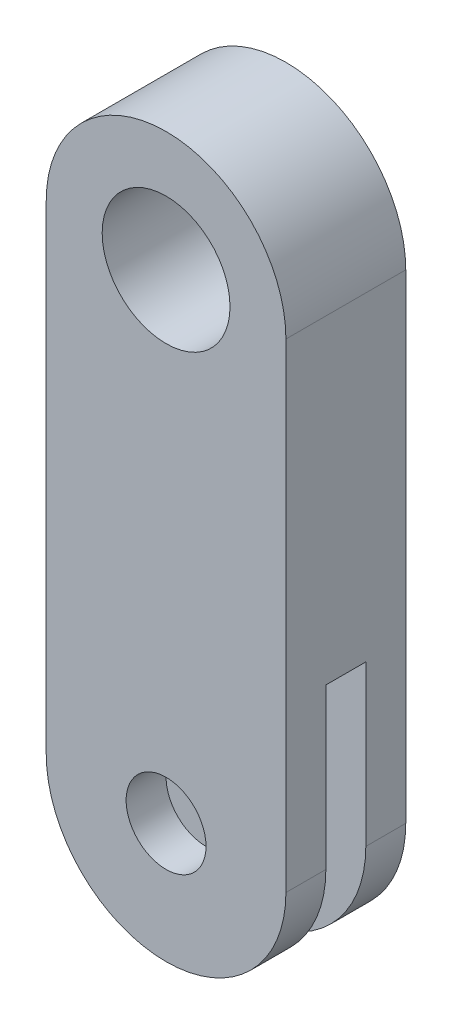
ISO-10303-21;
HEADER;
FILE_DESCRIPTION(('STEP AP214'),'2;1');
FILE_NAME('part.step','',(''),(''),'','','');
FILE_SCHEMA(('AUTOMOTIVE_DESIGN { 1 0 10303 214 1 1 1 1 }'));
ENDSEC;
DATA;
#1=APPLICATION_CONTEXT('core data for automotive mechanical design processes');
#2=APPLICATION_PROTOCOL_DEFINITION('international standard','automotive_design',2000,#1);
#3=PRODUCT_CONTEXT('',#1,'mechanical');
#4=PRODUCT('Part','Part','',(#3));
#5=PRODUCT_RELATED_PRODUCT_CATEGORY('part','',(#4));
#6=PRODUCT_DEFINITION_FORMATION('','',#4);
#7=PRODUCT_DEFINITION_CONTEXT('part definition',#1,'design');
#8=PRODUCT_DEFINITION('design','',#6,#7);
#9=PRODUCT_DEFINITION_SHAPE('','',#8);
#10=(LENGTH_UNIT() NAMED_UNIT(*) SI_UNIT(.MILLI.,.METRE.));
#11=(NAMED_UNIT(*) PLANE_ANGLE_UNIT() SI_UNIT($,.RADIAN.));
#12=(NAMED_UNIT(*) SI_UNIT($,.STERADIAN.) SOLID_ANGLE_UNIT());
#13=UNCERTAINTY_MEASURE_WITH_UNIT(LENGTH_MEASURE(1.E-05),#10,'distance_accuracy_value','');
#14=(GEOMETRIC_REPRESENTATION_CONTEXT(3) GLOBAL_UNCERTAINTY_ASSIGNED_CONTEXT((#13)) GLOBAL_UNIT_ASSIGNED_CONTEXT((#10,
#11,#12)) REPRESENTATION_CONTEXT('',''));
#15=CARTESIAN_POINT('',(0.,0.,0.));
#16=DIRECTION('',(0.,0.,1.));
#17=DIRECTION('',(1.,0.,0.));
#18=AXIS2_PLACEMENT_3D('',#15,#16,#17);
#19=CARTESIAN_POINT('',(-14.3340871670976,80.7958296065914,0.));
#20=DIRECTION('',(0.,0.,1.));
#21=DIRECTION('',(1.,0.,0.));
#22=AXIS2_PLACEMENT_3D('',#19,#20,#21);
#23=PLANE('',#22);
#24=CARTESIAN_POINT('',(-14.3340871670976,20.7958296065914,0.));
#25=DIRECTION('',(0.,0.,1.));
#26=DIRECTION('',(1.,0.,0.));
#27=AXIS2_PLACEMENT_3D('',#24,#25,#26);
#28=CIRCLE('',#27,5.);
#29=CARTESIAN_POINT('',(-9.33408716709757,20.7958296065914,0.));
#30=VERTEX_POINT('',#29);
#31=EDGE_CURVE('E162',#30,#30,#28,.T.);
#32=ORIENTED_EDGE('',*,*,#31,.T.);
#33=EDGE_LOOP('',(#32));
#34=FACE_BOUND('',#33,.T.);
#35=DIRECTION('',(-1.,0.,0.));
#36=VECTOR('',#35,1.);
#37=CARTESIAN_POINT('',(-29.3340871670976,40.7958296065915,0.));
#38=LINE('',#37,#36);
#39=CARTESIAN_POINT('',(0.665912832902425,40.7958296065914,0.));
#40=VERTEX_POINT('',#39);
#41=CARTESIAN_POINT('',(-29.3340871670976,40.7958296065915,0.));
#42=VERTEX_POINT('',#41);
#43=EDGE_CURVE('E48',#40,#42,#38,.T.);
#44=ORIENTED_EDGE('',*,*,#43,.F.);
#45=DIRECTION('',(0.,1.,0.));
#46=VECTOR('',#45,1.);
#47=CARTESIAN_POINT('',(0.665912832902422,20.7958296065914,0.));
#48=LINE('',#47,#46);
#49=CARTESIAN_POINT('',(0.665912832902425,20.7958296065914,0.));
#50=VERTEX_POINT('',#49);
#51=EDGE_CURVE('E170',#50,#40,#48,.T.);
#52=ORIENTED_EDGE('',*,*,#51,.F.);
#53=CARTESIAN_POINT('',(-14.3340871670976,20.7958296065914,0.));
#54=DIRECTION('',(0.,0.,1.));
#55=DIRECTION('',(1.,0.,0.));
#56=AXIS2_PLACEMENT_3D('',#53,#54,#55);
#57=CIRCLE('',#56,15.);
#58=CARTESIAN_POINT('',(-29.3340871670976,20.7958296065914,0.));
#59=VERTEX_POINT('',#58);
#60=EDGE_CURVE('E73',#59,#50,#57,.T.);
#61=ORIENTED_EDGE('',*,*,#60,.F.);
#62=DIRECTION('',(0.,-1.,0.));
#63=VECTOR('',#62,1.);
#64=CARTESIAN_POINT('',(-29.3340871670976,80.7958296065914,0.));
#65=LINE('',#64,#63);
#66=EDGE_CURVE('E166',#42,#59,#65,.T.);
#67=ORIENTED_EDGE('',*,*,#66,.F.);
#68=EDGE_LOOP('',(#44,#52,#61,#67));
#69=FACE_BOUND('',#68,.T.);
#70=ADVANCED_FACE('F33',(#34,#69),#23,.F.);
#71=CARTESIAN_POINT('',(-14.3340871670976,80.7958296065914,5.));
#72=DIRECTION('',(0.,0.,1.));
#73=DIRECTION('',(1.,0.,0.));
#74=AXIS2_PLACEMENT_3D('',#71,#72,#73);
#75=PLANE('',#74);
#76=CARTESIAN_POINT('',(-14.3340871670976,20.7958296065914,5.));
#77=DIRECTION('',(0.,0.,1.));
#78=DIRECTION('',(1.,0.,0.));
#79=AXIS2_PLACEMENT_3D('',#76,#77,#78);
#80=CIRCLE('',#79,5.);
#81=CARTESIAN_POINT('',(-9.33408716709757,20.7958296065914,5.));
#82=VERTEX_POINT('',#81);
#83=EDGE_CURVE('E163',#82,#82,#80,.T.);
#84=ORIENTED_EDGE('',*,*,#83,.F.);
#85=EDGE_LOOP('',(#84));
#86=FACE_BOUND('',#85,.T.);
#87=CARTESIAN_POINT('',(-14.3340871670976,80.7958296065914,5.));
#88=DIRECTION('',(0.,0.,1.));
#89=DIRECTION('',(1.,0.,0.));
#90=AXIS2_PLACEMENT_3D('',#87,#88,#89);
#91=CIRCLE('',#90,15.);
#92=CARTESIAN_POINT('',(0.66591283290243,80.7958296065914,5.));
#93=VERTEX_POINT('',#92);
#94=CARTESIAN_POINT('',(-29.3340871670976,80.7958296065914,5.));
#95=VERTEX_POINT('',#94);
#96=EDGE_CURVE('E113',#93,#95,#91,.T.);
#97=ORIENTED_EDGE('',*,*,#96,.T.);
#98=DIRECTION('',(0.,-1.,0.));
#99=VECTOR('',#98,1.);
#100=CARTESIAN_POINT('',(-29.3340871670976,80.7958296065914,5.));
#101=LINE('',#100,#99);
#102=CARTESIAN_POINT('',(-29.3340871670976,20.7958296065914,5.));
#103=VERTEX_POINT('',#102);
#104=EDGE_CURVE('E80',#95,#103,#101,.T.);
#105=ORIENTED_EDGE('',*,*,#104,.T.);
#106=CARTESIAN_POINT('',(-14.3340871670976,20.7958296065914,5.));
#107=DIRECTION('',(0.,0.,1.));
#108=DIRECTION('',(1.,0.,0.));
#109=AXIS2_PLACEMENT_3D('',#106,#107,#108);
#110=CIRCLE('',#109,15.);
#111=CARTESIAN_POINT('',(0.665912832902425,20.7958296065914,5.));
#112=VERTEX_POINT('',#111);
#113=EDGE_CURVE('E172',#103,#112,#110,.T.);
#114=ORIENTED_EDGE('',*,*,#113,.T.);
#115=DIRECTION('',(0.,1.,0.));
#116=VECTOR('',#115,1.);
#117=CARTESIAN_POINT('',(0.665912832902422,20.7958296065914,5.));
#118=LINE('',#117,#116);
#119=EDGE_CURVE('E57',#112,#93,#118,.T.);
#120=ORIENTED_EDGE('',*,*,#119,.T.);
#121=EDGE_LOOP('',(#97,#105,#114,#120));
#122=FACE_BOUND('',#121,.T.);
#123=CARTESIAN_POINT('',(-14.3340871670976,80.7958296065914,5.));
#124=DIRECTION('',(0.,0.,1.));
#125=DIRECTION('',(1.,0.,0.));
#126=AXIS2_PLACEMENT_3D('',#123,#124,#125);
#127=CIRCLE('',#126,8.);
#128=CARTESIAN_POINT('',(-6.33408716709757,80.7958296065914,5.));
#129=VERTEX_POINT('',#128);
#130=EDGE_CURVE('E159',#129,#129,#127,.T.);
#131=ORIENTED_EDGE('',*,*,#130,.F.);
#132=EDGE_LOOP('',(#131));
#133=FACE_BOUND('',#132,.T.);
#134=ADVANCED_FACE('F198',(#86,#122,#133),#75,.T.);
#135=CARTESIAN_POINT('',(-14.3340871670976,80.7958296065914,5.));
#136=DIRECTION('',(0.,0.,-1.));
#137=DIRECTION('',(-1.,0.,0.));
#138=AXIS2_PLACEMENT_3D('',#135,#136,#137);
#139=CYLINDRICAL_SURFACE('',#138,15.);
#140=DIRECTION('',(0.,0.,-1.));
#141=VECTOR('',#140,1.);
#142=CARTESIAN_POINT('',(0.66591283290243,80.7958296065914,5.));
#143=LINE('',#142,#141);
#144=CARTESIAN_POINT('',(0.66591283290243,80.7958296065914,-10.));
#145=VERTEX_POINT('',#144);
#146=EDGE_CURVE('E108',#93,#145,#143,.T.);
#147=ORIENTED_EDGE('',*,*,#146,.T.);
#148=CARTESIAN_POINT('',(-14.3340871670976,80.7958296065914,-10.));
#149=DIRECTION('',(0.,0.,-1.));
#150=DIRECTION('',(-1.,0.,0.));
#151=AXIS2_PLACEMENT_3D('',#148,#149,#150);
#152=CIRCLE('',#151,15.);
#153=CARTESIAN_POINT('',(-29.3340871670976,80.7958296065914,-10.));
#154=VERTEX_POINT('',#153);
#155=EDGE_CURVE('E112',#154,#145,#152,.T.);
#156=ORIENTED_EDGE('',*,*,#155,.F.);
#157=DIRECTION('',(0.,0.,-1.));
#158=VECTOR('',#157,1.);
#159=CARTESIAN_POINT('',(-29.3340871670976,80.7958296065914,5.));
#160=LINE('',#159,#158);
#161=EDGE_CURVE('E11',#95,#154,#160,.T.);
#162=ORIENTED_EDGE('',*,*,#161,.F.);
#163=ORIENTED_EDGE('',*,*,#96,.F.);
#164=EDGE_LOOP('',(#147,#156,#162,#163));
#165=FACE_BOUND('',#164,.T.);
#166=ADVANCED_FACE('F35',(#165),#139,.T.);
#167=CARTESIAN_POINT('',(-29.3340871670976,80.7958296065914,5.));
#168=DIRECTION('',(1.,0.,0.));
#169=DIRECTION('',(0.,0.,-1.));
#170=AXIS2_PLACEMENT_3D('',#167,#168,#169);
#171=PLANE('',#170);
#172=ORIENTED_EDGE('',*,*,#161,.T.);
#173=DIRECTION('',(0.,1.,0.));
#174=VECTOR('',#173,1.);
#175=CARTESIAN_POINT('',(-29.3340871670976,20.7958296065914,-10.));
#176=LINE('',#175,#174);
#177=CARTESIAN_POINT('',(-29.3340871670976,20.7958296065914,-10.));
#178=VERTEX_POINT('',#177);
#179=EDGE_CURVE('E130',#178,#154,#176,.T.);
#180=ORIENTED_EDGE('',*,*,#179,.F.);
#181=DIRECTION('',(0.,0.,1.));
#182=VECTOR('',#181,1.);
#183=CARTESIAN_POINT('',(-29.3340871670976,20.7958296065914,-10.));
#184=LINE('',#183,#182);
#185=CARTESIAN_POINT('',(-29.3340871670976,20.7958296065914,-5.));
#186=VERTEX_POINT('',#185);
#187=EDGE_CURVE('E142',#178,#186,#184,.T.);
#188=ORIENTED_EDGE('',*,*,#187,.T.);
#189=DIRECTION('',(0.,1.,0.));
#190=VECTOR('',#189,1.);
#191=CARTESIAN_POINT('',(-29.3340871670976,20.7958296065914,-5.));
#192=LINE('',#191,#190);
#193=CARTESIAN_POINT('',(-29.3340871670976,40.7958296065914,-5.));
#194=VERTEX_POINT('',#193);
#195=EDGE_CURVE('E131',#186,#194,#192,.T.);
#196=ORIENTED_EDGE('',*,*,#195,.T.);
#197=DIRECTION('',(0.,0.,1.));
#198=VECTOR('',#197,1.);
#199=CARTESIAN_POINT('',(-29.3340871670976,40.7958296065915,-5.));
#200=LINE('',#199,#198);
#201=EDGE_CURVE('E156',#194,#42,#200,.T.);
#202=ORIENTED_EDGE('',*,*,#201,.T.);
#203=ORIENTED_EDGE('',*,*,#66,.T.);
#204=DIRECTION('',(0.,0.,-1.));
#205=VECTOR('',#204,1.);
#206=CARTESIAN_POINT('',(-29.3340871670976,20.7958296065914,5.));
#207=LINE('',#206,#205);
#208=EDGE_CURVE('E41',#103,#59,#207,.T.);
#209=ORIENTED_EDGE('',*,*,#208,.F.);
#210=ORIENTED_EDGE('',*,*,#104,.F.);
#211=EDGE_LOOP('',(#172,#180,#188,#196,#202,#203,#209,#210));
#212=FACE_BOUND('',#211,.T.);
#213=ADVANCED_FACE('F191',(#212),#171,.F.);
#214=CARTESIAN_POINT('',(-14.3340871670976,20.7958296065914,5.));
#215=DIRECTION('',(0.,0.,-1.));
#216=DIRECTION('',(-1.,0.,0.));
#217=AXIS2_PLACEMENT_3D('',#214,#215,#216);
#218=CYLINDRICAL_SURFACE('',#217,15.);
#219=ORIENTED_EDGE('',*,*,#60,.T.);
#220=DIRECTION('',(0.,0.,-1.));
#221=VECTOR('',#220,1.);
#222=CARTESIAN_POINT('',(0.665912832902425,20.7958296065914,5.));
#223=LINE('',#222,#221);
#224=EDGE_CURVE('E115',#112,#50,#223,.T.);
#225=ORIENTED_EDGE('',*,*,#224,.F.);
#226=ORIENTED_EDGE('',*,*,#113,.F.);
#227=ORIENTED_EDGE('',*,*,#208,.T.);
#228=EDGE_LOOP('',(#219,#225,#226,#227));
#229=FACE_BOUND('',#228,.T.);
#230=ADVANCED_FACE('F179',(#229),#218,.T.);
#231=CARTESIAN_POINT('',(0.665912832902422,20.7958296065914,5.));
#232=DIRECTION('',(-1.,0.,0.));
#233=DIRECTION('',(0.,-1.,0.));
#234=AXIS2_PLACEMENT_3D('',#231,#232,#233);
#235=PLANE('',#234);
#236=ORIENTED_EDGE('',*,*,#51,.T.);
#237=DIRECTION('',(0.,0.,1.));
#238=VECTOR('',#237,1.);
#239=CARTESIAN_POINT('',(0.665912832902425,40.7958296065914,-5.));
#240=LINE('',#239,#238);
#241=CARTESIAN_POINT('',(0.665912832902425,40.7958296065914,-5.));
#242=VERTEX_POINT('',#241);
#243=EDGE_CURVE('E152',#242,#40,#240,.T.);
#244=ORIENTED_EDGE('',*,*,#243,.F.);
#245=DIRECTION('',(0.,-1.,0.));
#246=VECTOR('',#245,1.);
#247=CARTESIAN_POINT('',(0.66591283290243,80.7958296065914,-5.));
#248=LINE('',#247,#246);
#249=CARTESIAN_POINT('',(0.665912832902427,20.7958296065915,-5.));
#250=VERTEX_POINT('',#249);
#251=EDGE_CURVE('E143',#242,#250,#248,.T.);
#252=ORIENTED_EDGE('',*,*,#251,.T.);
#253=DIRECTION('',(0.,0.,1.));
#254=VECTOR('',#253,1.);
#255=CARTESIAN_POINT('',(0.665912832902427,20.7958296065915,-10.));
#256=LINE('',#255,#254);
#257=CARTESIAN_POINT('',(0.665912832902427,20.7958296065915,-10.));
#258=VERTEX_POINT('',#257);
#259=EDGE_CURVE('E121',#258,#250,#256,.T.);
#260=ORIENTED_EDGE('',*,*,#259,.F.);
#261=DIRECTION('',(0.,-1.,0.));
#262=VECTOR('',#261,1.);
#263=CARTESIAN_POINT('',(0.66591283290243,80.7958296065914,-10.));
#264=LINE('',#263,#262);
#265=EDGE_CURVE('E118',#145,#258,#264,.T.);
#266=ORIENTED_EDGE('',*,*,#265,.F.);
#267=ORIENTED_EDGE('',*,*,#146,.F.);
#268=ORIENTED_EDGE('',*,*,#119,.F.);
#269=ORIENTED_EDGE('',*,*,#224,.T.);
#270=EDGE_LOOP('',(#236,#244,#252,#260,#266,#267,#268,#269));
#271=FACE_BOUND('',#270,.T.);
#272=ADVANCED_FACE('F119',(#271),#235,.F.);
#273=CARTESIAN_POINT('',(-14.3340871670976,20.7958296065914,5.));
#274=DIRECTION('',(0.,0.,-1.));
#275=DIRECTION('',(-1.,0.,0.));
#276=AXIS2_PLACEMENT_3D('',#273,#274,#275);
#277=CYLINDRICAL_SURFACE('',#276,5.);
#278=ORIENTED_EDGE('',*,*,#83,.T.);
#279=EDGE_LOOP('',(#278));
#280=FACE_BOUND('',#279,.T.);
#281=ORIENTED_EDGE('',*,*,#31,.F.);
#282=EDGE_LOOP('',(#281));
#283=FACE_BOUND('',#282,.T.);
#284=ADVANCED_FACE('F210',(#280,#283),#277,.F.);
#285=CARTESIAN_POINT('',(-14.3340871670976,80.7958296065914,5.));
#286=DIRECTION('',(0.,0.,-1.));
#287=DIRECTION('',(-1.,0.,0.));
#288=AXIS2_PLACEMENT_3D('',#285,#286,#287);
#289=CYLINDRICAL_SURFACE('',#288,8.);
#290=ORIENTED_EDGE('',*,*,#130,.T.);
#291=EDGE_LOOP('',(#290));
#292=FACE_BOUND('',#291,.T.);
#293=CARTESIAN_POINT('',(-14.3340871670976,80.7958296065914,-10.));
#294=DIRECTION('',(0.,0.,-1.));
#295=DIRECTION('',(-1.,0.,0.));
#296=AXIS2_PLACEMENT_3D('',#293,#294,#295);
#297=CIRCLE('',#296,8.00000000000001);
#298=CARTESIAN_POINT('',(-22.3340871670976,80.7958296065914,-10.));
#299=VERTEX_POINT('',#298);
#300=EDGE_CURVE('E137',#299,#299,#297,.T.);
#301=ORIENTED_EDGE('',*,*,#300,.T.);
#302=EDGE_LOOP('',(#301));
#303=FACE_BOUND('',#302,.T.);
#304=ADVANCED_FACE('F214',(#292,#303),#289,.F.);
#305=CARTESIAN_POINT('',(-29.3340871670976,40.7958296065915,-5.));
#306=DIRECTION('',(0.,1.,0.));
#307=DIRECTION('',(-1.,0.,0.));
#308=AXIS2_PLACEMENT_3D('',#305,#306,#307);
#309=PLANE('',#308);
#310=ORIENTED_EDGE('',*,*,#43,.T.);
#311=ORIENTED_EDGE('',*,*,#201,.F.);
#312=DIRECTION('',(-1.,0.,0.));
#313=VECTOR('',#312,1.);
#314=CARTESIAN_POINT('',(-29.3340871670976,40.7958296065915,-5.));
#315=LINE('',#314,#313);
#316=EDGE_CURVE('E149',#242,#194,#315,.T.);
#317=ORIENTED_EDGE('',*,*,#316,.F.);
#318=ORIENTED_EDGE('',*,*,#243,.T.);
#319=EDGE_LOOP('',(#310,#311,#317,#318));
#320=FACE_BOUND('',#319,.T.);
#321=ADVANCED_FACE('F182',(#320),#309,.F.);
#322=CARTESIAN_POINT('',(-14.3340871670976,80.7958296065914,-5.));
#323=DIRECTION('',(0.,0.,-1.));
#324=DIRECTION('',(-1.,0.,0.));
#325=AXIS2_PLACEMENT_3D('',#322,#323,#324);
#326=PLANE('',#325);
#327=CARTESIAN_POINT('',(-14.3340871670976,20.7958296065914,-5.));
#328=DIRECTION('',(0.,0.,-1.));
#329=DIRECTION('',(-1.,0.,0.));
#330=AXIS2_PLACEMENT_3D('',#327,#328,#329);
#331=CIRCLE('',#330,5.);
#332=CARTESIAN_POINT('',(-19.3340871670976,20.7958296065914,-5.));
#333=VERTEX_POINT('',#332);
#334=EDGE_CURVE('E244',#333,#333,#331,.T.);
#335=ORIENTED_EDGE('',*,*,#334,.T.);
#336=EDGE_LOOP('',(#335));
#337=FACE_BOUND('',#336,.T.);
#338=ORIENTED_EDGE('',*,*,#251,.F.);
#339=ORIENTED_EDGE('',*,*,#316,.T.);
#340=ORIENTED_EDGE('',*,*,#195,.F.);
#341=CARTESIAN_POINT('',(-14.3340871670976,20.7958296065914,-5.));
#342=DIRECTION('',(0.,0.,-1.));
#343=DIRECTION('',(-1.,0.,0.));
#344=AXIS2_PLACEMENT_3D('',#341,#342,#343);
#345=CIRCLE('',#344,15.);
#346=EDGE_CURVE('E134',#250,#186,#345,.T.);
#347=ORIENTED_EDGE('',*,*,#346,.F.);
#348=EDGE_LOOP('',(#338,#339,#340,#347));
#349=FACE_BOUND('',#348,.T.);
#350=ADVANCED_FACE('F187',(#337,#349),#326,.F.);
#351=CARTESIAN_POINT('',(-14.3340871670976,80.7958296065914,-10.));
#352=DIRECTION('',(0.,0.,-1.));
#353=DIRECTION('',(-1.,0.,0.));
#354=AXIS2_PLACEMENT_3D('',#351,#352,#353);
#355=PLANE('',#354);
#356=ORIENTED_EDGE('',*,*,#300,.F.);
#357=EDGE_LOOP('',(#356));
#358=FACE_BOUND('',#357,.T.);
#359=ORIENTED_EDGE('',*,*,#155,.T.);
#360=ORIENTED_EDGE('',*,*,#265,.T.);
#361=CARTESIAN_POINT('',(-14.3340871670976,20.7958296065914,-10.));
#362=DIRECTION('',(0.,0.,-1.));
#363=DIRECTION('',(-1.,0.,0.));
#364=AXIS2_PLACEMENT_3D('',#361,#362,#363);
#365=CIRCLE('',#364,15.);
#366=EDGE_CURVE('E124',#258,#178,#365,.T.);
#367=ORIENTED_EDGE('',*,*,#366,.T.);
#368=ORIENTED_EDGE('',*,*,#179,.T.);
#369=EDGE_LOOP('',(#359,#360,#367,#368));
#370=FACE_BOUND('',#369,.T.);
#371=CARTESIAN_POINT('',(-14.3340871670976,20.7958296065914,-10.));
#372=DIRECTION('',(0.,0.,-1.));
#373=DIRECTION('',(-1.,0.,0.));
#374=AXIS2_PLACEMENT_3D('',#371,#372,#373);
#375=CIRCLE('',#374,5.);
#376=CARTESIAN_POINT('',(-19.3340871670976,20.7958296065914,-10.));
#377=VERTEX_POINT('',#376);
#378=EDGE_CURVE('E241',#377,#377,#375,.T.);
#379=ORIENTED_EDGE('',*,*,#378,.F.);
#380=EDGE_LOOP('',(#379));
#381=FACE_BOUND('',#380,.T.);
#382=ADVANCED_FACE('F127',(#358,#370,#381),#355,.T.);
#383=CARTESIAN_POINT('',(-14.3340871670976,20.7958296065914,-10.));
#384=DIRECTION('',(0.,0.,1.));
#385=DIRECTION('',(1.,0.,0.));
#386=AXIS2_PLACEMENT_3D('',#383,#384,#385);
#387=CYLINDRICAL_SURFACE('',#386,15.);
#388=ORIENTED_EDGE('',*,*,#346,.T.);
#389=ORIENTED_EDGE('',*,*,#187,.F.);
#390=ORIENTED_EDGE('',*,*,#366,.F.);
#391=ORIENTED_EDGE('',*,*,#259,.T.);
#392=EDGE_LOOP('',(#388,#389,#390,#391));
#393=FACE_BOUND('',#392,.T.);
#394=ADVANCED_FACE('F189',(#393),#387,.T.);
#395=CARTESIAN_POINT('',(-14.3340871670976,20.7958296065914,-10.));
#396=DIRECTION('',(0.,0.,1.));
#397=DIRECTION('',(1.,0.,0.));
#398=AXIS2_PLACEMENT_3D('',#395,#396,#397);
#399=CYLINDRICAL_SURFACE('',#398,5.);
#400=ORIENTED_EDGE('',*,*,#378,.T.);
#401=EDGE_LOOP('',(#400));
#402=FACE_BOUND('',#401,.T.);
#403=ORIENTED_EDGE('',*,*,#334,.F.);
#404=EDGE_LOOP('',(#403));
#405=FACE_BOUND('',#404,.T.);
#406=ADVANCED_FACE('F227',(#402,#405),#399,.F.);
#407=CLOSED_SHELL('',(#70,#134,#166,#213,#230,#272,#284,#304,#321,#350,#382,#394,#406));
#408=MANIFOLD_SOLID_BREP('B2',#407);
#409=ADVANCED_BREP_SHAPE_REPRESENTATION('',(#18,#408),#14);
#410=SHAPE_DEFINITION_REPRESENTATION(#9,#409);
ENDSEC;
END-ISO-10303-21;
